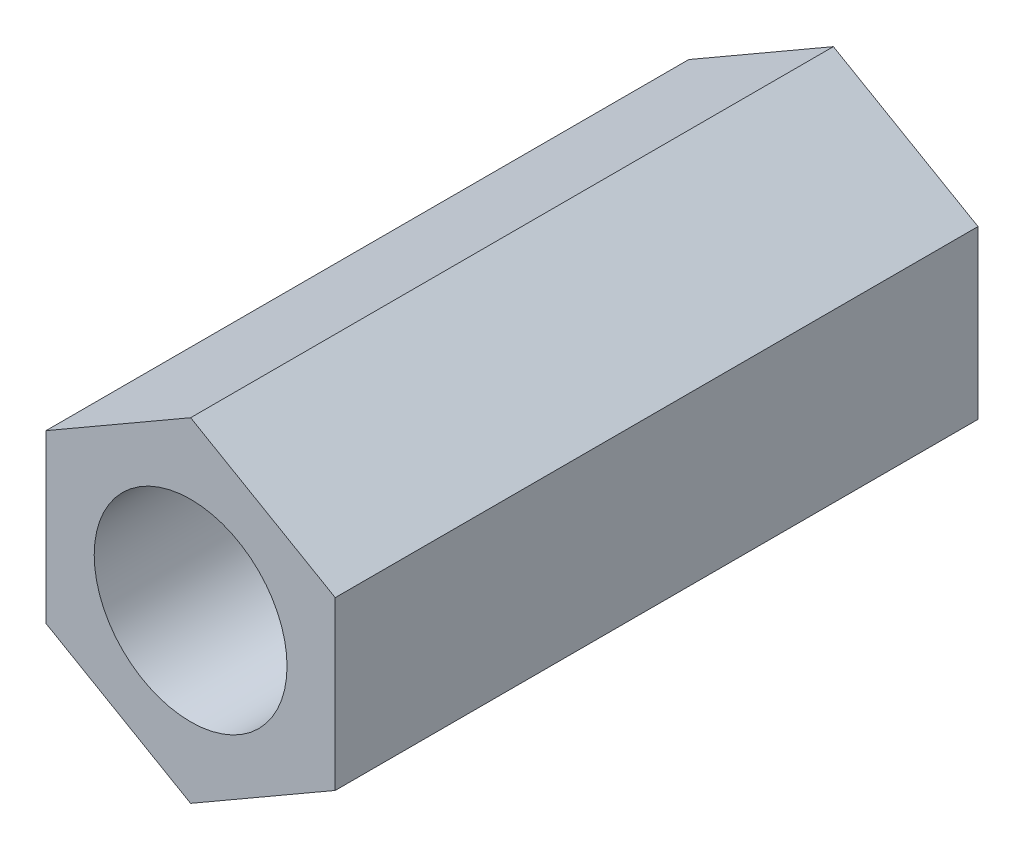
ISO-10303-21;
HEADER;
FILE_DESCRIPTION(('STEP AP214'),'2;1');
FILE_NAME('part.step','',(''),(''),'','','');
FILE_SCHEMA(('AUTOMOTIVE_DESIGN { 1 0 10303 214 1 1 1 1 }'));
ENDSEC;
DATA;
#1=APPLICATION_CONTEXT('core data for automotive mechanical design processes');
#2=APPLICATION_PROTOCOL_DEFINITION('international standard','automotive_design',2000,#1);
#3=PRODUCT_CONTEXT('',#1,'mechanical');
#4=PRODUCT('Part','Part','',(#3));
#5=PRODUCT_RELATED_PRODUCT_CATEGORY('part','',(#4));
#6=PRODUCT_DEFINITION_FORMATION('','',#4);
#7=PRODUCT_DEFINITION_CONTEXT('part definition',#1,'design');
#8=PRODUCT_DEFINITION('design','',#6,#7);
#9=PRODUCT_DEFINITION_SHAPE('','',#8);
#10=(LENGTH_UNIT() NAMED_UNIT(*) SI_UNIT(.MILLI.,.METRE.));
#11=(NAMED_UNIT(*) PLANE_ANGLE_UNIT() SI_UNIT($,.RADIAN.));
#12=(NAMED_UNIT(*) SI_UNIT($,.STERADIAN.) SOLID_ANGLE_UNIT());
#13=UNCERTAINTY_MEASURE_WITH_UNIT(LENGTH_MEASURE(1.E-05),#10,'distance_accuracy_value','');
#14=(GEOMETRIC_REPRESENTATION_CONTEXT(3) GLOBAL_UNCERTAINTY_ASSIGNED_CONTEXT((#13)) GLOBAL_UNIT_ASSIGNED_CONTEXT((#10,
#11,#12)) REPRESENTATION_CONTEXT('',''));
#15=CARTESIAN_POINT('',(0.,0.,0.));
#16=DIRECTION('',(0.,0.,1.));
#17=DIRECTION('',(1.,0.,0.));
#18=AXIS2_PLACEMENT_3D('',#15,#16,#17);
#19=CARTESIAN_POINT('',(0.,2.59807621135332,5.));
#20=DIRECTION('',(0.,0.,1.));
#21=DIRECTION('',(1.,0.,0.));
#22=AXIS2_PLACEMENT_3D('',#19,#20,#21);
#23=PLANE('',#22);
#24=DIRECTION('',(-0.866025403784439,0.499999999999999,0.));
#25=VECTOR('',#24,1.);
#26=CARTESIAN_POINT('',(2.25,1.29903810567666,5.));
#27=LINE('',#26,#25);
#28=CARTESIAN_POINT('',(2.25,1.29903810567666,5.));
#29=VERTEX_POINT('',#28);
#30=CARTESIAN_POINT('',(0.,2.59807621135332,5.));
#31=VERTEX_POINT('',#30);
#32=EDGE_CURVE('E128',#29,#31,#27,.T.);
#33=ORIENTED_EDGE('',*,*,#32,.T.);
#34=DIRECTION('',(-0.866025403784438,-0.5,0.));
#35=VECTOR('',#34,1.);
#36=CARTESIAN_POINT('',(0.,2.59807621135332,5.));
#37=LINE('',#36,#35);
#38=CARTESIAN_POINT('',(-2.25,1.29903810567666,5.));
#39=VERTEX_POINT('',#38);
#40=EDGE_CURVE('E95',#31,#39,#37,.T.);
#41=ORIENTED_EDGE('',*,*,#40,.T.);
#42=DIRECTION('',(0.,-1.,0.));
#43=VECTOR('',#42,1.);
#44=CARTESIAN_POINT('',(-2.25,1.29903810567666,5.));
#45=LINE('',#44,#43);
#46=CARTESIAN_POINT('',(-2.25,-1.29903810567666,5.));
#47=VERTEX_POINT('',#46);
#48=EDGE_CURVE('E131',#39,#47,#45,.T.);
#49=ORIENTED_EDGE('',*,*,#48,.T.);
#50=DIRECTION('',(0.866025403784439,-0.499999999999999,0.));
#51=VECTOR('',#50,1.);
#52=CARTESIAN_POINT('',(-2.25,-1.29903810567666,5.));
#53=LINE('',#52,#51);
#54=CARTESIAN_POINT('',(0.,-2.59807621135331,5.));
#55=VERTEX_POINT('',#54);
#56=EDGE_CURVE('E133',#47,#55,#53,.T.);
#57=ORIENTED_EDGE('',*,*,#56,.T.);
#58=DIRECTION('',(0.866025403784438,0.5,0.));
#59=VECTOR('',#58,1.);
#60=CARTESIAN_POINT('',(0.,-2.59807621135331,5.));
#61=LINE('',#60,#59);
#62=CARTESIAN_POINT('',(2.25,-1.29903810567666,5.));
#63=VERTEX_POINT('',#62);
#64=EDGE_CURVE('E59',#55,#63,#61,.T.);
#65=ORIENTED_EDGE('',*,*,#64,.T.);
#66=DIRECTION('',(0.,1.,0.));
#67=VECTOR('',#66,1.);
#68=CARTESIAN_POINT('',(2.25,-1.29903810567666,5.));
#69=LINE('',#68,#67);
#70=EDGE_CURVE('E54',#63,#29,#69,.T.);
#71=ORIENTED_EDGE('',*,*,#70,.T.);
#72=EDGE_LOOP('',(#33,#41,#49,#57,#65,#71));
#73=FACE_BOUND('',#72,.T.);
#74=CARTESIAN_POINT('',(0.,0.,5.));
#75=DIRECTION('',(0.,0.,1.));
#76=DIRECTION('',(1.,0.,0.));
#77=AXIS2_PLACEMENT_3D('',#74,#75,#76);
#78=CIRCLE('',#77,1.5);
#79=CARTESIAN_POINT('',(1.5,0.,5.));
#80=VERTEX_POINT('',#79);
#81=EDGE_CURVE('E125',#80,#80,#78,.T.);
#82=ORIENTED_EDGE('',*,*,#81,.F.);
#83=EDGE_LOOP('',(#82));
#84=FACE_BOUND('',#83,.T.);
#85=ADVANCED_FACE('F39',(#73,#84),#23,.T.);
#86=CARTESIAN_POINT('',(2.25,1.29903810567666,5.));
#87=DIRECTION('',(-0.499999999999999,-0.866025403784439,0.));
#88=DIRECTION('',(0.866025403784439,-0.499999999999999,0.));
#89=AXIS2_PLACEMENT_3D('',#86,#87,#88);
#90=PLANE('',#89);
#91=DIRECTION('',(0.,0.,-1.));
#92=VECTOR('',#91,1.);
#93=CARTESIAN_POINT('',(2.25,1.29903810567666,5.));
#94=LINE('',#93,#92);
#95=CARTESIAN_POINT('',(2.25,1.29903810567666,-5.));
#96=VERTEX_POINT('',#95);
#97=EDGE_CURVE('E110',#29,#96,#94,.T.);
#98=ORIENTED_EDGE('',*,*,#97,.T.);
#99=DIRECTION('',(-0.866025403784439,0.499999999999999,0.));
#100=VECTOR('',#99,1.);
#101=CARTESIAN_POINT('',(2.25,1.29903810567666,-5.));
#102=LINE('',#101,#100);
#103=CARTESIAN_POINT('',(0.,2.59807621135332,-5.));
#104=VERTEX_POINT('',#103);
#105=EDGE_CURVE('E104',#96,#104,#102,.T.);
#106=ORIENTED_EDGE('',*,*,#105,.T.);
#107=DIRECTION('',(0.,0.,-1.));
#108=VECTOR('',#107,1.);
#109=CARTESIAN_POINT('',(0.,2.59807621135332,5.));
#110=LINE('',#109,#108);
#111=EDGE_CURVE('E11',#31,#104,#110,.T.);
#112=ORIENTED_EDGE('',*,*,#111,.F.);
#113=ORIENTED_EDGE('',*,*,#32,.F.);
#114=EDGE_LOOP('',(#98,#106,#112,#113));
#115=FACE_BOUND('',#114,.T.);
#116=ADVANCED_FACE('F41',(#115),#90,.F.);
#117=CARTESIAN_POINT('',(0.,2.59807621135332,5.));
#118=DIRECTION('',(0.5,-0.866025403784439,0.));
#119=DIRECTION('',(0.866025403784439,0.5,0.));
#120=AXIS2_PLACEMENT_3D('',#117,#118,#119);
#121=PLANE('',#120);
#122=ORIENTED_EDGE('',*,*,#111,.T.);
#123=DIRECTION('',(-0.866025403784438,-0.5,0.));
#124=VECTOR('',#123,1.);
#125=CARTESIAN_POINT('',(0.,2.59807621135332,-5.));
#126=LINE('',#125,#124);
#127=CARTESIAN_POINT('',(-2.25,1.29903810567666,-5.));
#128=VERTEX_POINT('',#127);
#129=EDGE_CURVE('E94',#104,#128,#126,.T.);
#130=ORIENTED_EDGE('',*,*,#129,.T.);
#131=DIRECTION('',(0.,0.,-1.));
#132=VECTOR('',#131,1.);
#133=CARTESIAN_POINT('',(-2.25,1.29903810567666,5.));
#134=LINE('',#133,#132);
#135=EDGE_CURVE('E47',#39,#128,#134,.T.);
#136=ORIENTED_EDGE('',*,*,#135,.F.);
#137=ORIENTED_EDGE('',*,*,#40,.F.);
#138=EDGE_LOOP('',(#122,#130,#136,#137));
#139=FACE_BOUND('',#138,.T.);
#140=ADVANCED_FACE('F92',(#139),#121,.F.);
#141=CARTESIAN_POINT('',(-2.25,1.29903810567666,5.));
#142=DIRECTION('',(1.,0.,0.));
#143=DIRECTION('',(0.,0.,-1.));
#144=AXIS2_PLACEMENT_3D('',#141,#142,#143);
#145=PLANE('',#144);
#146=ORIENTED_EDGE('',*,*,#135,.T.);
#147=DIRECTION('',(0.,-1.,0.));
#148=VECTOR('',#147,1.);
#149=CARTESIAN_POINT('',(-2.25,1.29903810567666,-5.));
#150=LINE('',#149,#148);
#151=CARTESIAN_POINT('',(-2.25,-1.29903810567666,-5.));
#152=VERTEX_POINT('',#151);
#153=EDGE_CURVE('E108',#128,#152,#150,.T.);
#154=ORIENTED_EDGE('',*,*,#153,.T.);
#155=DIRECTION('',(0.,0.,-1.));
#156=VECTOR('',#155,1.);
#157=CARTESIAN_POINT('',(-2.25,-1.29903810567666,5.));
#158=LINE('',#157,#156);
#159=EDGE_CURVE('E142',#47,#152,#158,.T.);
#160=ORIENTED_EDGE('',*,*,#159,.F.);
#161=ORIENTED_EDGE('',*,*,#48,.F.);
#162=EDGE_LOOP('',(#146,#154,#160,#161));
#163=FACE_BOUND('',#162,.T.);
#164=ADVANCED_FACE('F145',(#163),#145,.F.);
#165=CARTESIAN_POINT('',(-2.25,-1.29903810567666,5.));
#166=DIRECTION('',(0.5,0.866025403784439,0.));
#167=DIRECTION('',(-0.866025403784439,0.5,0.));
#168=AXIS2_PLACEMENT_3D('',#165,#166,#167);
#169=PLANE('',#168);
#170=ORIENTED_EDGE('',*,*,#159,.T.);
#171=DIRECTION('',(0.866025403784439,-0.499999999999999,0.));
#172=VECTOR('',#171,1.);
#173=CARTESIAN_POINT('',(-2.25,-1.29903810567666,-5.));
#174=LINE('',#173,#172);
#175=CARTESIAN_POINT('',(0.,-2.59807621135331,-5.));
#176=VERTEX_POINT('',#175);
#177=EDGE_CURVE('E117',#152,#176,#174,.T.);
#178=ORIENTED_EDGE('',*,*,#177,.T.);
#179=DIRECTION('',(0.,0.,-1.));
#180=VECTOR('',#179,1.);
#181=CARTESIAN_POINT('',(0.,-2.59807621135331,5.));
#182=LINE('',#181,#180);
#183=EDGE_CURVE('E140',#55,#176,#182,.T.);
#184=ORIENTED_EDGE('',*,*,#183,.F.);
#185=ORIENTED_EDGE('',*,*,#56,.F.);
#186=EDGE_LOOP('',(#170,#178,#184,#185));
#187=FACE_BOUND('',#186,.T.);
#188=ADVANCED_FACE('F151',(#187),#169,.F.);
#189=CARTESIAN_POINT('',(0.,-2.59807621135331,5.));
#190=DIRECTION('',(-0.5,0.866025403784438,0.));
#191=DIRECTION('',(-0.866025403784439,-0.5,0.));
#192=AXIS2_PLACEMENT_3D('',#189,#190,#191);
#193=PLANE('',#192);
#194=ORIENTED_EDGE('',*,*,#183,.T.);
#195=DIRECTION('',(0.866025403784438,0.5,0.));
#196=VECTOR('',#195,1.);
#197=CARTESIAN_POINT('',(0.,-2.59807621135331,-5.));
#198=LINE('',#197,#196);
#199=CARTESIAN_POINT('',(2.25,-1.29903810567666,-5.));
#200=VERTEX_POINT('',#199);
#201=EDGE_CURVE('E120',#176,#200,#198,.T.);
#202=ORIENTED_EDGE('',*,*,#201,.T.);
#203=DIRECTION('',(0.,0.,-1.));
#204=VECTOR('',#203,1.);
#205=CARTESIAN_POINT('',(2.25,-1.29903810567666,5.));
#206=LINE('',#205,#204);
#207=EDGE_CURVE('E138',#63,#200,#206,.T.);
#208=ORIENTED_EDGE('',*,*,#207,.F.);
#209=ORIENTED_EDGE('',*,*,#64,.F.);
#210=EDGE_LOOP('',(#194,#202,#208,#209));
#211=FACE_BOUND('',#210,.T.);
#212=ADVANCED_FACE('F154',(#211),#193,.F.);
#213=CARTESIAN_POINT('',(2.25,-1.29903810567666,5.));
#214=DIRECTION('',(-1.,0.,0.));
#215=DIRECTION('',(0.,-1.,0.));
#216=AXIS2_PLACEMENT_3D('',#213,#214,#215);
#217=PLANE('',#216);
#218=ORIENTED_EDGE('',*,*,#207,.T.);
#219=DIRECTION('',(0.,1.,0.));
#220=VECTOR('',#219,1.);
#221=CARTESIAN_POINT('',(2.25,-1.29903810567666,-5.));
#222=LINE('',#221,#220);
#223=EDGE_CURVE('E123',#200,#96,#222,.T.);
#224=ORIENTED_EDGE('',*,*,#223,.T.);
#225=ORIENTED_EDGE('',*,*,#97,.F.);
#226=ORIENTED_EDGE('',*,*,#70,.F.);
#227=EDGE_LOOP('',(#218,#224,#225,#226));
#228=FACE_BOUND('',#227,.T.);
#229=ADVANCED_FACE('F156',(#228),#217,.F.);
#230=CARTESIAN_POINT('',(0.,0.,5.));
#231=DIRECTION('',(0.,0.,-1.));
#232=DIRECTION('',(-1.,0.,0.));
#233=AXIS2_PLACEMENT_3D('',#230,#231,#232);
#234=CYLINDRICAL_SURFACE('',#233,1.5);
#235=ORIENTED_EDGE('',*,*,#81,.T.);
#236=EDGE_LOOP('',(#235));
#237=FACE_BOUND('',#236,.T.);
#238=CARTESIAN_POINT('',(0.,0.,-5.));
#239=DIRECTION('',(0.,0.,1.));
#240=DIRECTION('',(1.,0.,0.));
#241=AXIS2_PLACEMENT_3D('',#238,#239,#240);
#242=CIRCLE('',#241,1.5);
#243=CARTESIAN_POINT('',(1.5,0.,-5.));
#244=VERTEX_POINT('',#243);
#245=EDGE_CURVE('E111',#244,#244,#242,.T.);
#246=ORIENTED_EDGE('',*,*,#245,.F.);
#247=EDGE_LOOP('',(#246));
#248=FACE_BOUND('',#247,.T.);
#249=ADVANCED_FACE('F158',(#237,#248),#234,.F.);
#250=CARTESIAN_POINT('',(0.,2.59807621135332,-5.));
#251=DIRECTION('',(0.,0.,1.));
#252=DIRECTION('',(1.,0.,0.));
#253=AXIS2_PLACEMENT_3D('',#250,#251,#252);
#254=PLANE('',#253);
#255=ORIENTED_EDGE('',*,*,#245,.T.);
#256=EDGE_LOOP('',(#255));
#257=FACE_BOUND('',#256,.T.);
#258=ORIENTED_EDGE('',*,*,#105,.F.);
#259=ORIENTED_EDGE('',*,*,#223,.F.);
#260=ORIENTED_EDGE('',*,*,#201,.F.);
#261=ORIENTED_EDGE('',*,*,#177,.F.);
#262=ORIENTED_EDGE('',*,*,#153,.F.);
#263=ORIENTED_EDGE('',*,*,#129,.F.);
#264=EDGE_LOOP('',(#258,#259,#260,#261,#262,#263));
#265=FACE_BOUND('',#264,.T.);
#266=ADVANCED_FACE('F102',(#257,#265),#254,.F.);
#267=CLOSED_SHELL('',(#85,#116,#140,#164,#188,#212,#229,#249,#266));
#268=MANIFOLD_SOLID_BREP('B2',#267);
#269=ADVANCED_BREP_SHAPE_REPRESENTATION('',(#18,#268),#14);
#270=SHAPE_DEFINITION_REPRESENTATION(#9,#269);
ENDSEC;
END-ISO-10303-21;
